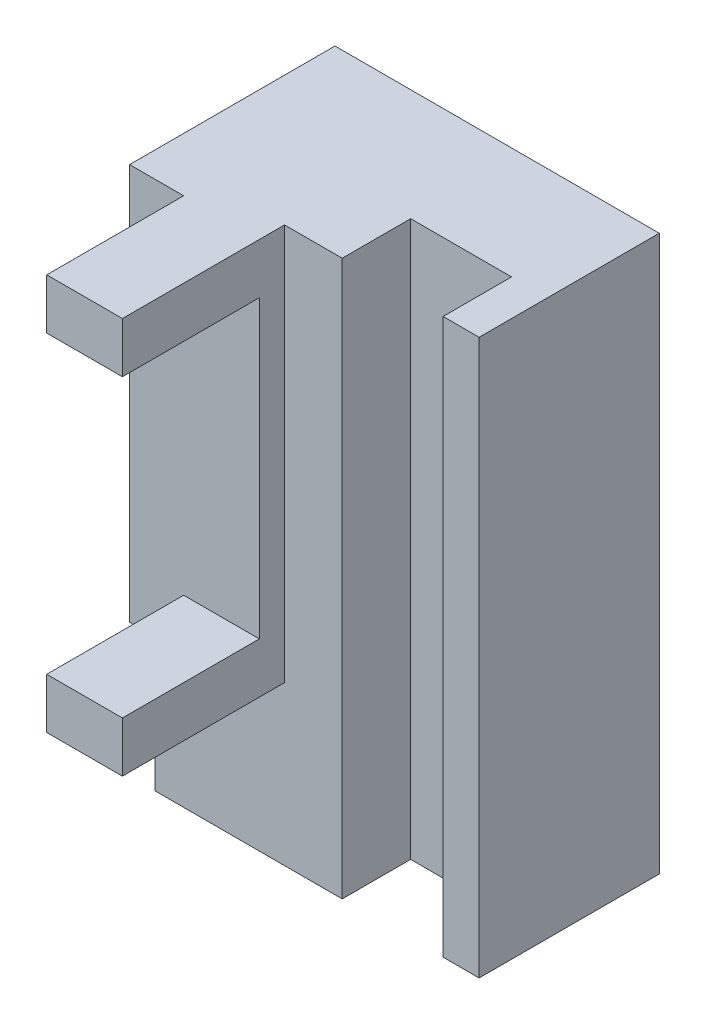
ISO-10303-21;
HEADER;
FILE_DESCRIPTION(('STEP AP214'),'2;1');
FILE_NAME('part.step','',(''),(''),'','','');
FILE_SCHEMA(('AUTOMOTIVE_DESIGN { 1 0 10303 214 1 1 1 1 }'));
ENDSEC;
DATA;
#1=APPLICATION_CONTEXT('core data for automotive mechanical design processes');
#2=APPLICATION_PROTOCOL_DEFINITION('international standard','automotive_design',2000,#1);
#3=PRODUCT_CONTEXT('',#1,'mechanical');
#4=PRODUCT('Part','Part','',(#3));
#5=PRODUCT_RELATED_PRODUCT_CATEGORY('part','',(#4));
#6=PRODUCT_DEFINITION_FORMATION('','',#4);
#7=PRODUCT_DEFINITION_CONTEXT('part definition',#1,'design');
#8=PRODUCT_DEFINITION('design','',#6,#7);
#9=PRODUCT_DEFINITION_SHAPE('','',#8);
#10=(LENGTH_UNIT() NAMED_UNIT(*) SI_UNIT(.MILLI.,.METRE.));
#11=(NAMED_UNIT(*) PLANE_ANGLE_UNIT() SI_UNIT($,.RADIAN.));
#12=(NAMED_UNIT(*) SI_UNIT($,.STERADIAN.) SOLID_ANGLE_UNIT());
#13=UNCERTAINTY_MEASURE_WITH_UNIT(LENGTH_MEASURE(1.E-05),#10,'distance_accuracy_value','');
#14=(GEOMETRIC_REPRESENTATION_CONTEXT(3) GLOBAL_UNCERTAINTY_ASSIGNED_CONTEXT((#13)) GLOBAL_UNIT_ASSIGNED_CONTEXT((#10,
#11,#12)) REPRESENTATION_CONTEXT('',''));
#15=CARTESIAN_POINT('',(0.,0.,0.));
#16=DIRECTION('',(0.,0.,1.));
#17=DIRECTION('',(1.,0.,0.));
#18=AXIS2_PLACEMENT_3D('',#15,#16,#17);
#19=CARTESIAN_POINT('',(0.,0.,25.));
#20=DIRECTION('',(0.,0.,1.));
#21=DIRECTION('',(1.,0.,0.));
#22=AXIS2_PLACEMENT_3D('',#19,#20,#21);
#23=PLANE('',#22);
#24=DIRECTION('',(1.,0.,0.));
#25=VECTOR('',#24,1.);
#26=CARTESIAN_POINT('',(-21.2780898876404,0.575842696629199,25.));
#27=LINE('',#26,#25);
#28=CARTESIAN_POINT('',(-28.7780898876404,0.575842696629199,25.));
#29=VERTEX_POINT('',#28);
#30=CARTESIAN_POINT('',(-10.7780898876404,0.575842696629199,25.));
#31=VERTEX_POINT('',#30);
#32=EDGE_CURVE('E298',#29,#31,#27,.T.);
#33=ORIENTED_EDGE('',*,*,#32,.F.);
#34=DIRECTION('',(0.,-1.,0.));
#35=VECTOR('',#34,1.);
#36=CARTESIAN_POINT('',(-28.7780898876404,55.5758426966292,25.));
#37=LINE('',#36,#35);
#38=CARTESIAN_POINT('',(-28.7780898876404,-21.4241573033708,25.));
#39=VERTEX_POINT('',#38);
#40=EDGE_CURVE('E218',#29,#39,#37,.T.);
#41=ORIENTED_EDGE('',*,*,#40,.T.);
#42=DIRECTION('',(1.,0.,0.));
#43=VECTOR('',#42,1.);
#44=CARTESIAN_POINT('',(-28.7780898876404,-21.4241573033708,25.));
#45=LINE('',#44,#43);
#46=CARTESIAN_POINT('',(-2.77808988764044,-21.4241573033708,25.));
#47=VERTEX_POINT('',#46);
#48=EDGE_CURVE('E222',#39,#47,#45,.T.);
#49=ORIENTED_EDGE('',*,*,#48,.T.);
#50=DIRECTION('',(0.,-1.,0.));
#51=VECTOR('',#50,1.);
#52=CARTESIAN_POINT('',(-2.77808988764044,55.5758426966292,25.));
#53=LINE('',#52,#51);
#54=CARTESIAN_POINT('',(-2.77808988764044,55.5758426966292,25.));
#55=VERTEX_POINT('',#54);
#56=EDGE_CURVE('E209',#55,#47,#53,.T.);
#57=ORIENTED_EDGE('',*,*,#56,.F.);
#58=DIRECTION('',(-1.,0.,0.));
#59=VECTOR('',#58,1.);
#60=CARTESIAN_POINT('',(-28.7780898876404,55.5758426966292,25.));
#61=LINE('',#60,#59);
#62=CARTESIAN_POINT('',(-10.7780898876404,55.5758426966292,25.));
#63=VERTEX_POINT('',#62);
#64=EDGE_CURVE('E227',#55,#63,#61,.T.);
#65=ORIENTED_EDGE('',*,*,#64,.T.);
#66=DIRECTION('',(0.,1.,0.));
#67=VECTOR('',#66,1.);
#68=CARTESIAN_POINT('',(-10.7780898876404,55.5758426966292,25.));
#69=LINE('',#68,#67);
#70=EDGE_CURVE('E181',#31,#63,#69,.T.);
#71=ORIENTED_EDGE('',*,*,#70,.F.);
#72=EDGE_LOOP('',(#33,#41,#49,#57,#65,#71));
#73=FACE_BOUND('',#72,.T.);
#74=ADVANCED_FACE('F35',(#73),#23,.T.);
#75=CARTESIAN_POINT('',(-21.2780898876404,55.5758426966292,28.5));
#76=DIRECTION('',(1.,0.,0.));
#77=DIRECTION('',(0.,1.,0.));
#78=AXIS2_PLACEMENT_3D('',#75,#76,#77);
#79=PLANE('',#78);
#80=DIRECTION('',(0.,1.,0.));
#81=VECTOR('',#80,1.);
#82=CARTESIAN_POINT('',(-21.2780898876404,55.5758426966292,28.5));
#83=LINE('',#82,#81);
#84=CARTESIAN_POINT('',(-21.2780898876404,0.5758426966292,28.5));
#85=VERTEX_POINT('',#84);
#86=CARTESIAN_POINT('',(-21.2780898876404,7.5758426966292,28.5));
#87=VERTEX_POINT('',#86);
#88=EDGE_CURVE('E161',#85,#87,#83,.T.);
#89=ORIENTED_EDGE('',*,*,#88,.F.);
#90=DIRECTION('',(0.,0.,-1.));
#91=VECTOR('',#90,1.);
#92=CARTESIAN_POINT('',(-21.2780898876404,0.575842696629199,28.5));
#93=LINE('',#92,#91);
#94=CARTESIAN_POINT('',(-21.2780898876404,0.575842696629198,47.5));
#95=VERTEX_POINT('',#94);
#96=EDGE_CURVE('E188',#95,#85,#93,.T.);
#97=ORIENTED_EDGE('',*,*,#96,.F.);
#98=DIRECTION('',(0.,-1.,0.));
#99=VECTOR('',#98,1.);
#100=CARTESIAN_POINT('',(-21.2780898876404,0.575842696629198,47.5));
#101=LINE('',#100,#99);
#102=CARTESIAN_POINT('',(-21.2780898876404,7.5758426966292,47.5));
#103=VERTEX_POINT('',#102);
#104=EDGE_CURVE('E286',#103,#95,#101,.T.);
#105=ORIENTED_EDGE('',*,*,#104,.F.);
#106=DIRECTION('',(0.,0.,-1.));
#107=VECTOR('',#106,1.);
#108=CARTESIAN_POINT('',(-21.2780898876404,7.5758426966292,47.5));
#109=LINE('',#108,#107);
#110=EDGE_CURVE('E292',#103,#87,#109,.T.);
#111=ORIENTED_EDGE('',*,*,#110,.T.);
#112=EDGE_LOOP('',(#89,#97,#105,#111));
#113=FACE_BOUND('',#112,.T.);
#114=ADVANCED_FACE('F326',(#113),#79,.F.);
#115=CARTESIAN_POINT('',(-21.2780898876404,48.5758426966292,28.5));
#116=VERTEX_POINT('',#115);
#117=CARTESIAN_POINT('',(-21.2780898876404,55.5758426966292,28.5));
#118=VERTEX_POINT('',#117);
#119=EDGE_CURVE('E151',#116,#118,#83,.T.);
#120=ORIENTED_EDGE('',*,*,#119,.F.);
#121=DIRECTION('',(0.,0.,-1.));
#122=VECTOR('',#121,1.);
#123=CARTESIAN_POINT('',(-21.2780898876404,48.5758426966292,47.5));
#124=LINE('',#123,#122);
#125=CARTESIAN_POINT('',(-21.2780898876404,48.5758426966292,47.5));
#126=VERTEX_POINT('',#125);
#127=EDGE_CURVE('E279',#126,#116,#124,.T.);
#128=ORIENTED_EDGE('',*,*,#127,.F.);
#129=DIRECTION('',(0.,-1.,0.));
#130=VECTOR('',#129,1.);
#131=CARTESIAN_POINT('',(-21.2780898876404,55.5758426966292,47.5));
#132=LINE('',#131,#130);
#133=CARTESIAN_POINT('',(-21.2780898876404,55.5758426966292,47.5));
#134=VERTEX_POINT('',#133);
#135=EDGE_CURVE('E175',#134,#126,#132,.T.);
#136=ORIENTED_EDGE('',*,*,#135,.F.);
#137=DIRECTION('',(0.,0.,-1.));
#138=VECTOR('',#137,1.);
#139=CARTESIAN_POINT('',(-21.2780898876404,55.5758426966292,28.5));
#140=LINE('',#139,#138);
#141=EDGE_CURVE('E166',#134,#118,#140,.T.);
#142=ORIENTED_EDGE('',*,*,#141,.T.);
#143=EDGE_LOOP('',(#120,#128,#136,#142));
#144=FACE_BOUND('',#143,.T.);
#145=ADVANCED_FACE('F173',(#144),#79,.F.);
#146=CARTESIAN_POINT('',(0.,0.,28.5));
#147=DIRECTION('',(0.,0.,1.));
#148=DIRECTION('',(1.,0.,0.));
#149=AXIS2_PLACEMENT_3D('',#146,#147,#148);
#150=PLANE('',#149);
#151=DIRECTION('',(0.,1.,0.));
#152=VECTOR('',#151,1.);
#153=CARTESIAN_POINT('',(-10.7780898876404,55.5758426966292,28.5));
#154=LINE('',#153,#152);
#155=CARTESIAN_POINT('',(-10.7780898876404,7.5758426966292,28.5));
#156=VERTEX_POINT('',#155);
#157=CARTESIAN_POINT('',(-10.7780898876404,48.5758426966292,28.5));
#158=VERTEX_POINT('',#157);
#159=EDGE_CURVE('E50',#156,#158,#154,.T.);
#160=ORIENTED_EDGE('',*,*,#159,.T.);
#161=DIRECTION('',(1.,0.,0.));
#162=VECTOR('',#161,1.);
#163=CARTESIAN_POINT('',(-21.2780898876404,48.5758426966292,28.5));
#164=LINE('',#163,#162);
#165=EDGE_CURVE('E156',#116,#158,#164,.T.);
#166=ORIENTED_EDGE('',*,*,#165,.F.);
#167=ORIENTED_EDGE('',*,*,#119,.T.);
#168=DIRECTION('',(-1.,0.,0.));
#169=VECTOR('',#168,1.);
#170=CARTESIAN_POINT('',(-21.2780898876404,55.5758426966292,28.5));
#171=LINE('',#170,#169);
#172=CARTESIAN_POINT('',(-28.7780898876404,55.5758426966292,28.5));
#173=VERTEX_POINT('',#172);
#174=EDGE_CURVE('E154',#118,#173,#171,.T.);
#175=ORIENTED_EDGE('',*,*,#174,.T.);
#176=DIRECTION('',(0.,-1.,0.));
#177=VECTOR('',#176,1.);
#178=CARTESIAN_POINT('',(-28.7780898876404,55.5758426966292,28.5));
#179=LINE('',#178,#177);
#180=CARTESIAN_POINT('',(-28.7780898876404,0.575842696629199,28.5));
#181=VERTEX_POINT('',#180);
#182=EDGE_CURVE('E170',#173,#181,#179,.T.);
#183=ORIENTED_EDGE('',*,*,#182,.T.);
#184=DIRECTION('',(1.,0.,0.));
#185=VECTOR('',#184,1.);
#186=CARTESIAN_POINT('',(-21.2780898876404,0.5758426966292,28.5));
#187=LINE('',#186,#185);
#188=EDGE_CURVE('E262',#181,#85,#187,.T.);
#189=ORIENTED_EDGE('',*,*,#188,.T.);
#190=ORIENTED_EDGE('',*,*,#88,.T.);
#191=DIRECTION('',(-1.,0.,0.));
#192=VECTOR('',#191,1.);
#193=CARTESIAN_POINT('',(-10.7780898876404,7.5758426966292,28.5));
#194=LINE('',#193,#192);
#195=EDGE_CURVE('E55',#156,#87,#194,.T.);
#196=ORIENTED_EDGE('',*,*,#195,.F.);
#197=EDGE_LOOP('',(#160,#166,#167,#175,#183,#189,#190,#196));
#198=FACE_BOUND('',#197,.T.);
#199=ADVANCED_FACE('F153',(#198),#150,.T.);
#200=CARTESIAN_POINT('',(-28.7780898876404,55.5758426966292,25.));
#201=DIRECTION('',(1.,0.,0.));
#202=DIRECTION('',(0.,1.,0.));
#203=AXIS2_PLACEMENT_3D('',#200,#201,#202);
#204=PLANE('',#203);
#205=DIRECTION('',(0.,-1.,0.));
#206=VECTOR('',#205,1.);
#207=CARTESIAN_POINT('',(-28.7780898876404,55.5758426966292,0.));
#208=LINE('',#207,#206);
#209=CARTESIAN_POINT('',(-28.7780898876404,55.5758426966292,0.));
#210=VERTEX_POINT('',#209);
#211=CARTESIAN_POINT('',(-28.7780898876404,-21.4241573033708,0.));
#212=VERTEX_POINT('',#211);
#213=EDGE_CURVE('E211',#210,#212,#208,.T.);
#214=ORIENTED_EDGE('',*,*,#213,.T.);
#215=DIRECTION('',(0.,0.,-1.));
#216=VECTOR('',#215,1.);
#217=CARTESIAN_POINT('',(-28.7780898876404,-21.4241573033708,25.));
#218=LINE('',#217,#216);
#219=EDGE_CURVE('E11',#39,#212,#218,.T.);
#220=ORIENTED_EDGE('',*,*,#219,.F.);
#221=ORIENTED_EDGE('',*,*,#40,.F.);
#222=DIRECTION('',(0.,0.,-1.));
#223=VECTOR('',#222,1.);
#224=CARTESIAN_POINT('',(-28.7780898876404,0.575842696629199,28.5));
#225=LINE('',#224,#223);
#226=EDGE_CURVE('E260',#181,#29,#225,.T.);
#227=ORIENTED_EDGE('',*,*,#226,.F.);
#228=ORIENTED_EDGE('',*,*,#182,.F.);
#229=DIRECTION('',(0.,0.,-1.));
#230=VECTOR('',#229,1.);
#231=CARTESIAN_POINT('',(-28.7780898876404,55.5758426966292,25.));
#232=LINE('',#231,#230);
#233=EDGE_CURVE('E169',#173,#210,#232,.T.);
#234=ORIENTED_EDGE('',*,*,#233,.T.);
#235=EDGE_LOOP('',(#214,#220,#221,#227,#228,#234));
#236=FACE_BOUND('',#235,.T.);
#237=ADVANCED_FACE('F37',(#236),#204,.F.);
#238=CARTESIAN_POINT('',(-28.7780898876404,-21.4241573033708,25.));
#239=DIRECTION('',(0.,1.,0.));
#240=DIRECTION('',(0.,0.,1.));
#241=AXIS2_PLACEMENT_3D('',#238,#239,#240);
#242=PLANE('',#241);
#243=DIRECTION('',(1.,0.,0.));
#244=VECTOR('',#243,1.);
#245=CARTESIAN_POINT('',(-2.77808988764044,-21.4241573033708,15.5));
#246=LINE('',#245,#244);
#247=CARTESIAN_POINT('',(-2.77808988764044,-21.4241573033708,15.5));
#248=VERTEX_POINT('',#247);
#249=CARTESIAN_POINT('',(11.2219101123596,-21.4241573033708,15.5));
#250=VERTEX_POINT('',#249);
#251=EDGE_CURVE('E205',#248,#250,#246,.T.);
#252=ORIENTED_EDGE('',*,*,#251,.F.);
#253=DIRECTION('',(0.,0.,-1.));
#254=VECTOR('',#253,1.);
#255=CARTESIAN_POINT('',(-2.77808988764044,-21.4241573033708,25.));
#256=LINE('',#255,#254);
#257=EDGE_CURVE('E191',#47,#248,#256,.T.);
#258=ORIENTED_EDGE('',*,*,#257,.F.);
#259=ORIENTED_EDGE('',*,*,#48,.F.);
#260=ORIENTED_EDGE('',*,*,#219,.T.);
#261=DIRECTION('',(1.,0.,0.));
#262=VECTOR('',#261,1.);
#263=CARTESIAN_POINT('',(-28.7780898876404,-21.4241573033708,0.));
#264=LINE('',#263,#262);
#265=CARTESIAN_POINT('',(16.2219101123596,-21.4241573033708,0.));
#266=VERTEX_POINT('',#265);
#267=EDGE_CURVE('E233',#212,#266,#264,.T.);
#268=ORIENTED_EDGE('',*,*,#267,.T.);
#269=DIRECTION('',(0.,0.,-1.));
#270=VECTOR('',#269,1.);
#271=CARTESIAN_POINT('',(16.2219101123596,-21.4241573033708,25.));
#272=LINE('',#271,#270);
#273=CARTESIAN_POINT('',(16.2219101123596,-21.4241573033708,25.));
#274=VERTEX_POINT('',#273);
#275=EDGE_CURVE('E43',#274,#266,#272,.T.);
#276=ORIENTED_EDGE('',*,*,#275,.F.);
#277=CARTESIAN_POINT('',(11.2219101123596,-21.4241573033708,25.));
#278=VERTEX_POINT('',#277);
#279=EDGE_CURVE('E220',#278,#274,#45,.T.);
#280=ORIENTED_EDGE('',*,*,#279,.F.);
#281=DIRECTION('',(0.,0.,1.));
#282=VECTOR('',#281,1.);
#283=CARTESIAN_POINT('',(11.2219101123596,-21.4241573033708,25.));
#284=LINE('',#283,#282);
#285=EDGE_CURVE('E196',#250,#278,#284,.T.);
#286=ORIENTED_EDGE('',*,*,#285,.F.);
#287=EDGE_LOOP('',(#252,#258,#259,#260,#268,#276,#280,#286));
#288=FACE_BOUND('',#287,.T.);
#289=ADVANCED_FACE('F348',(#288),#242,.F.);
#290=CARTESIAN_POINT('',(16.2219101123596,55.5758426966292,25.));
#291=DIRECTION('',(-1.,0.,0.));
#292=DIRECTION('',(0.,-1.,0.));
#293=AXIS2_PLACEMENT_3D('',#290,#291,#292);
#294=PLANE('',#293);
#295=DIRECTION('',(0.,1.,0.));
#296=VECTOR('',#295,1.);
#297=CARTESIAN_POINT('',(16.2219101123596,55.5758426966292,0.));
#298=LINE('',#297,#296);
#299=CARTESIAN_POINT('',(16.2219101123596,55.5758426966292,0.));
#300=VERTEX_POINT('',#299);
#301=EDGE_CURVE('E235',#266,#300,#298,.T.);
#302=ORIENTED_EDGE('',*,*,#301,.T.);
#303=DIRECTION('',(0.,0.,-1.));
#304=VECTOR('',#303,1.);
#305=CARTESIAN_POINT('',(16.2219101123596,55.5758426966292,25.));
#306=LINE('',#305,#304);
#307=CARTESIAN_POINT('',(16.2219101123596,55.5758426966292,25.));
#308=VERTEX_POINT('',#307);
#309=EDGE_CURVE('E239',#308,#300,#306,.T.);
#310=ORIENTED_EDGE('',*,*,#309,.F.);
#311=DIRECTION('',(0.,1.,0.));
#312=VECTOR('',#311,1.);
#313=CARTESIAN_POINT('',(16.2219101123596,55.5758426966292,25.));
#314=LINE('',#313,#312);
#315=EDGE_CURVE('E225',#274,#308,#314,.T.);
#316=ORIENTED_EDGE('',*,*,#315,.F.);
#317=ORIENTED_EDGE('',*,*,#275,.T.);
#318=EDGE_LOOP('',(#302,#310,#316,#317));
#319=FACE_BOUND('',#318,.T.);
#320=ADVANCED_FACE('F246',(#319),#294,.F.);
#321=CARTESIAN_POINT('',(-28.7780898876404,55.5758426966292,25.));
#322=DIRECTION('',(0.,-1.,0.));
#323=DIRECTION('',(0.,0.,-1.));
#324=AXIS2_PLACEMENT_3D('',#321,#322,#323);
#325=PLANE('',#324);
#326=ORIENTED_EDGE('',*,*,#233,.F.);
#327=ORIENTED_EDGE('',*,*,#174,.F.);
#328=ORIENTED_EDGE('',*,*,#141,.F.);
#329=DIRECTION('',(-1.,0.,0.));
#330=VECTOR('',#329,1.);
#331=CARTESIAN_POINT('',(-21.2780898876404,55.5758426966292,47.5));
#332=LINE('',#331,#330);
#333=CARTESIAN_POINT('',(-10.7780898876404,55.5758426966292,47.5));
#334=VERTEX_POINT('',#333);
#335=EDGE_CURVE('E273',#334,#134,#332,.T.);
#336=ORIENTED_EDGE('',*,*,#335,.F.);
#337=DIRECTION('',(0.,0.,-1.));
#338=VECTOR('',#337,1.);
#339=CARTESIAN_POINT('',(-10.7780898876404,55.5758426966292,28.5));
#340=LINE('',#339,#338);
#341=EDGE_CURVE('E176',#334,#63,#340,.T.);
#342=ORIENTED_EDGE('',*,*,#341,.T.);
#343=ORIENTED_EDGE('',*,*,#64,.F.);
#344=DIRECTION('',(0.,0.,-1.));
#345=VECTOR('',#344,1.);
#346=CARTESIAN_POINT('',(-2.77808988764044,55.5758426966292,25.));
#347=LINE('',#346,#345);
#348=CARTESIAN_POINT('',(-2.77808988764044,55.5758426966292,15.5));
#349=VERTEX_POINT('',#348);
#350=EDGE_CURVE('E192',#55,#349,#347,.T.);
#351=ORIENTED_EDGE('',*,*,#350,.T.);
#352=DIRECTION('',(1.,0.,0.));
#353=VECTOR('',#352,1.);
#354=CARTESIAN_POINT('',(-2.77808988764044,55.5758426966292,15.5));
#355=LINE('',#354,#353);
#356=CARTESIAN_POINT('',(11.2219101123596,55.5758426966292,15.5));
#357=VERTEX_POINT('',#356);
#358=EDGE_CURVE('E195',#349,#357,#355,.T.);
#359=ORIENTED_EDGE('',*,*,#358,.T.);
#360=DIRECTION('',(0.,0.,1.));
#361=VECTOR('',#360,1.);
#362=CARTESIAN_POINT('',(11.2219101123596,55.5758426966292,25.));
#363=LINE('',#362,#361);
#364=CARTESIAN_POINT('',(11.2219101123596,55.5758426966292,25.));
#365=VERTEX_POINT('',#364);
#366=EDGE_CURVE('E199',#357,#365,#363,.T.);
#367=ORIENTED_EDGE('',*,*,#366,.T.);
#368=EDGE_CURVE('E228',#308,#365,#61,.T.);
#369=ORIENTED_EDGE('',*,*,#368,.F.);
#370=ORIENTED_EDGE('',*,*,#309,.T.);
#371=DIRECTION('',(-1.,0.,0.));
#372=VECTOR('',#371,1.);
#373=CARTESIAN_POINT('',(-28.7780898876404,55.5758426966292,0.));
#374=LINE('',#373,#372);
#375=EDGE_CURVE('E221',#300,#210,#374,.T.);
#376=ORIENTED_EDGE('',*,*,#375,.T.);
#377=EDGE_LOOP('',(#326,#327,#328,#336,#342,#343,#351,#359,#367,#369,#370,#376));
#378=FACE_BOUND('',#377,.T.);
#379=ADVANCED_FACE('F164',(#378),#325,.F.);
#380=DIRECTION('',(0.,-1.,0.));
#381=VECTOR('',#380,1.);
#382=CARTESIAN_POINT('',(11.2219101123596,55.5758426966292,25.));
#383=LINE('',#382,#381);
#384=EDGE_CURVE('E212',#365,#278,#383,.T.);
#385=ORIENTED_EDGE('',*,*,#384,.T.);
#386=ORIENTED_EDGE('',*,*,#279,.T.);
#387=ORIENTED_EDGE('',*,*,#315,.T.);
#388=ORIENTED_EDGE('',*,*,#368,.T.);
#389=EDGE_LOOP('',(#385,#386,#387,#388));
#390=FACE_BOUND('',#389,.T.);
#391=ADVANCED_FACE('F328',(#390),#23,.T.);
#392=CARTESIAN_POINT('',(0.,0.,0.));
#393=DIRECTION('',(0.,0.,1.));
#394=DIRECTION('',(1.,0.,0.));
#395=AXIS2_PLACEMENT_3D('',#392,#393,#394);
#396=PLANE('',#395);
#397=ORIENTED_EDGE('',*,*,#213,.F.);
#398=ORIENTED_EDGE('',*,*,#375,.F.);
#399=ORIENTED_EDGE('',*,*,#301,.F.);
#400=ORIENTED_EDGE('',*,*,#267,.F.);
#401=EDGE_LOOP('',(#397,#398,#399,#400));
#402=FACE_BOUND('',#401,.T.);
#403=ADVANCED_FACE('F253',(#402),#396,.F.);
#404=CARTESIAN_POINT('',(-2.77808988764044,55.5758426966292,25.));
#405=DIRECTION('',(-1.,0.,0.));
#406=DIRECTION('',(0.,0.,1.));
#407=AXIS2_PLACEMENT_3D('',#404,#405,#406);
#408=PLANE('',#407);
#409=ORIENTED_EDGE('',*,*,#257,.T.);
#410=DIRECTION('',(0.,-1.,0.));
#411=VECTOR('',#410,1.);
#412=CARTESIAN_POINT('',(-2.77808988764044,55.5758426966292,15.5));
#413=LINE('',#412,#411);
#414=EDGE_CURVE('E202',#349,#248,#413,.T.);
#415=ORIENTED_EDGE('',*,*,#414,.F.);
#416=ORIENTED_EDGE('',*,*,#350,.F.);
#417=ORIENTED_EDGE('',*,*,#56,.T.);
#418=EDGE_LOOP('',(#409,#415,#416,#417));
#419=FACE_BOUND('',#418,.T.);
#420=ADVANCED_FACE('F342',(#419),#408,.F.);
#421=CARTESIAN_POINT('',(11.2219101123596,55.5758426966292,25.));
#422=DIRECTION('',(1.,0.,0.));
#423=DIRECTION('',(0.,0.,-1.));
#424=AXIS2_PLACEMENT_3D('',#421,#422,#423);
#425=PLANE('',#424);
#426=ORIENTED_EDGE('',*,*,#285,.T.);
#427=ORIENTED_EDGE('',*,*,#384,.F.);
#428=ORIENTED_EDGE('',*,*,#366,.F.);
#429=DIRECTION('',(0.,-1.,0.));
#430=VECTOR('',#429,1.);
#431=CARTESIAN_POINT('',(11.2219101123596,55.5758426966292,15.5));
#432=LINE('',#431,#430);
#433=EDGE_CURVE('E215',#357,#250,#432,.T.);
#434=ORIENTED_EDGE('',*,*,#433,.T.);
#435=EDGE_LOOP('',(#426,#427,#428,#434));
#436=FACE_BOUND('',#435,.T.);
#437=ADVANCED_FACE('F350',(#436),#425,.F.);
#438=CARTESIAN_POINT('',(-2.77808988764044,55.5758426966292,15.5));
#439=DIRECTION('',(0.,0.,-1.));
#440=DIRECTION('',(-1.,0.,0.));
#441=AXIS2_PLACEMENT_3D('',#438,#439,#440);
#442=PLANE('',#441);
#443=ORIENTED_EDGE('',*,*,#251,.T.);
#444=ORIENTED_EDGE('',*,*,#433,.F.);
#445=ORIENTED_EDGE('',*,*,#358,.F.);
#446=ORIENTED_EDGE('',*,*,#414,.T.);
#447=EDGE_LOOP('',(#443,#444,#445,#446));
#448=FACE_BOUND('',#447,.T.);
#449=ADVANCED_FACE('F353',(#448),#442,.F.);
#450=CARTESIAN_POINT('',(-21.2780898876404,0.575842696629199,28.5));
#451=DIRECTION('',(0.,1.,0.));
#452=DIRECTION('',(-1.,0.,0.));
#453=AXIS2_PLACEMENT_3D('',#450,#451,#452);
#454=PLANE('',#453);
#455=ORIENTED_EDGE('',*,*,#32,.T.);
#456=DIRECTION('',(0.,0.,-1.));
#457=VECTOR('',#456,1.);
#458=CARTESIAN_POINT('',(-10.7780898876404,0.575842696629199,28.5));
#459=LINE('',#458,#457);
#460=CARTESIAN_POINT('',(-10.7780898876404,0.575842696629199,47.5));
#461=VERTEX_POINT('',#460);
#462=EDGE_CURVE('E179',#461,#31,#459,.T.);
#463=ORIENTED_EDGE('',*,*,#462,.F.);
#464=DIRECTION('',(1.,0.,0.));
#465=VECTOR('',#464,1.);
#466=CARTESIAN_POINT('',(-10.7780898876404,0.575842696629199,47.5));
#467=LINE('',#466,#465);
#468=EDGE_CURVE('E289',#95,#461,#467,.T.);
#469=ORIENTED_EDGE('',*,*,#468,.F.);
#470=ORIENTED_EDGE('',*,*,#96,.T.);
#471=ORIENTED_EDGE('',*,*,#188,.F.);
#472=ORIENTED_EDGE('',*,*,#226,.T.);
#473=EDGE_LOOP('',(#455,#463,#469,#470,#471,#472));
#474=FACE_BOUND('',#473,.T.);
#475=ADVANCED_FACE('F357',(#474),#454,.F.);
#476=CARTESIAN_POINT('',(-10.7780898876404,55.5758426966292,28.5));
#477=DIRECTION('',(-1.,0.,0.));
#478=DIRECTION('',(0.,-1.,0.));
#479=AXIS2_PLACEMENT_3D('',#476,#477,#478);
#480=PLANE('',#479);
#481=ORIENTED_EDGE('',*,*,#70,.T.);
#482=ORIENTED_EDGE('',*,*,#341,.F.);
#483=DIRECTION('',(0.,1.,0.));
#484=VECTOR('',#483,1.);
#485=CARTESIAN_POINT('',(-10.7780898876404,55.5758426966292,47.5));
#486=LINE('',#485,#484);
#487=CARTESIAN_POINT('',(-10.7780898876404,48.5758426966292,47.5));
#488=VERTEX_POINT('',#487);
#489=EDGE_CURVE('E270',#488,#334,#486,.T.);
#490=ORIENTED_EDGE('',*,*,#489,.F.);
#491=DIRECTION('',(0.,0.,-1.));
#492=VECTOR('',#491,1.);
#493=CARTESIAN_POINT('',(-10.7780898876404,48.5758426966292,47.5));
#494=LINE('',#493,#492);
#495=EDGE_CURVE('E275',#488,#158,#494,.T.);
#496=ORIENTED_EDGE('',*,*,#495,.T.);
#497=ORIENTED_EDGE('',*,*,#159,.F.);
#498=DIRECTION('',(0.,0.,-1.));
#499=VECTOR('',#498,1.);
#500=CARTESIAN_POINT('',(-10.7780898876404,7.5758426966292,47.5));
#501=LINE('',#500,#499);
#502=CARTESIAN_POINT('',(-10.7780898876404,7.5758426966292,47.5));
#503=VERTEX_POINT('',#502);
#504=EDGE_CURVE('E296',#503,#156,#501,.T.);
#505=ORIENTED_EDGE('',*,*,#504,.F.);
#506=DIRECTION('',(0.,1.,0.));
#507=VECTOR('',#506,1.);
#508=CARTESIAN_POINT('',(-10.7780898876404,0.575842696629199,47.5));
#509=LINE('',#508,#507);
#510=EDGE_CURVE('E281',#461,#503,#509,.T.);
#511=ORIENTED_EDGE('',*,*,#510,.F.);
#512=ORIENTED_EDGE('',*,*,#462,.T.);
#513=EDGE_LOOP('',(#481,#482,#490,#496,#497,#505,#511,#512));
#514=FACE_BOUND('',#513,.T.);
#515=ADVANCED_FACE('F303',(#514),#480,.F.);
#516=CARTESIAN_POINT('',(-10.7780898876404,7.5758426966292,47.5));
#517=DIRECTION('',(0.,-1.,0.));
#518=DIRECTION('',(1.,0.,0.));
#519=AXIS2_PLACEMENT_3D('',#516,#517,#518);
#520=PLANE('',#519);
#521=ORIENTED_EDGE('',*,*,#195,.T.);
#522=ORIENTED_EDGE('',*,*,#110,.F.);
#523=DIRECTION('',(-1.,0.,0.));
#524=VECTOR('',#523,1.);
#525=CARTESIAN_POINT('',(-10.7780898876404,7.5758426966292,47.5));
#526=LINE('',#525,#524);
#527=EDGE_CURVE('E284',#503,#103,#526,.T.);
#528=ORIENTED_EDGE('',*,*,#527,.F.);
#529=ORIENTED_EDGE('',*,*,#504,.T.);
#530=EDGE_LOOP('',(#521,#522,#528,#529));
#531=FACE_BOUND('',#530,.T.);
#532=ADVANCED_FACE('F322',(#531),#520,.F.);
#533=CARTESIAN_POINT('',(0.,0.,47.5));
#534=DIRECTION('',(0.,0.,1.));
#535=DIRECTION('',(1.,0.,0.));
#536=AXIS2_PLACEMENT_3D('',#533,#534,#535);
#537=PLANE('',#536);
#538=ORIENTED_EDGE('',*,*,#510,.T.);
#539=ORIENTED_EDGE('',*,*,#527,.T.);
#540=ORIENTED_EDGE('',*,*,#104,.T.);
#541=ORIENTED_EDGE('',*,*,#468,.T.);
#542=EDGE_LOOP('',(#538,#539,#540,#541));
#543=FACE_BOUND('',#542,.T.);
#544=ADVANCED_FACE('F315',(#543),#537,.T.);
#545=CARTESIAN_POINT('',(-21.2780898876404,48.5758426966292,47.5));
#546=DIRECTION('',(0.,1.,0.));
#547=DIRECTION('',(0.,0.,1.));
#548=AXIS2_PLACEMENT_3D('',#545,#546,#547);
#549=PLANE('',#548);
#550=ORIENTED_EDGE('',*,*,#165,.T.);
#551=ORIENTED_EDGE('',*,*,#495,.F.);
#552=DIRECTION('',(1.,0.,0.));
#553=VECTOR('',#552,1.);
#554=CARTESIAN_POINT('',(-21.2780898876404,48.5758426966292,47.5));
#555=LINE('',#554,#553);
#556=EDGE_CURVE('E268',#126,#488,#555,.T.);
#557=ORIENTED_EDGE('',*,*,#556,.F.);
#558=ORIENTED_EDGE('',*,*,#127,.T.);
#559=EDGE_LOOP('',(#550,#551,#557,#558));
#560=FACE_BOUND('',#559,.T.);
#561=ADVANCED_FACE('F313',(#560),#549,.F.);
#562=CARTESIAN_POINT('',(0.,0.,47.5));
#563=DIRECTION('',(0.,0.,1.));
#564=DIRECTION('',(1.,0.,0.));
#565=AXIS2_PLACEMENT_3D('',#562,#563,#564);
#566=PLANE('',#565);
#567=ORIENTED_EDGE('',*,*,#135,.T.);
#568=ORIENTED_EDGE('',*,*,#556,.T.);
#569=ORIENTED_EDGE('',*,*,#489,.T.);
#570=ORIENTED_EDGE('',*,*,#335,.T.);
#571=EDGE_LOOP('',(#567,#568,#569,#570));
#572=FACE_BOUND('',#571,.T.);
#573=ADVANCED_FACE('F309',(#572),#566,.T.);
#574=CLOSED_SHELL('',(#74,#114,#145,#199,#237,#289,#320,#379,#391,#403,#420,#437,#449,#475,#515,
#532,#544,#561,#573));
#575=MANIFOLD_SOLID_BREP('B2',#574);
#576=ADVANCED_BREP_SHAPE_REPRESENTATION('',(#18,#575),#14);
#577=SHAPE_DEFINITION_REPRESENTATION(#9,#576);
ENDSEC;
END-ISO-10303-21;
